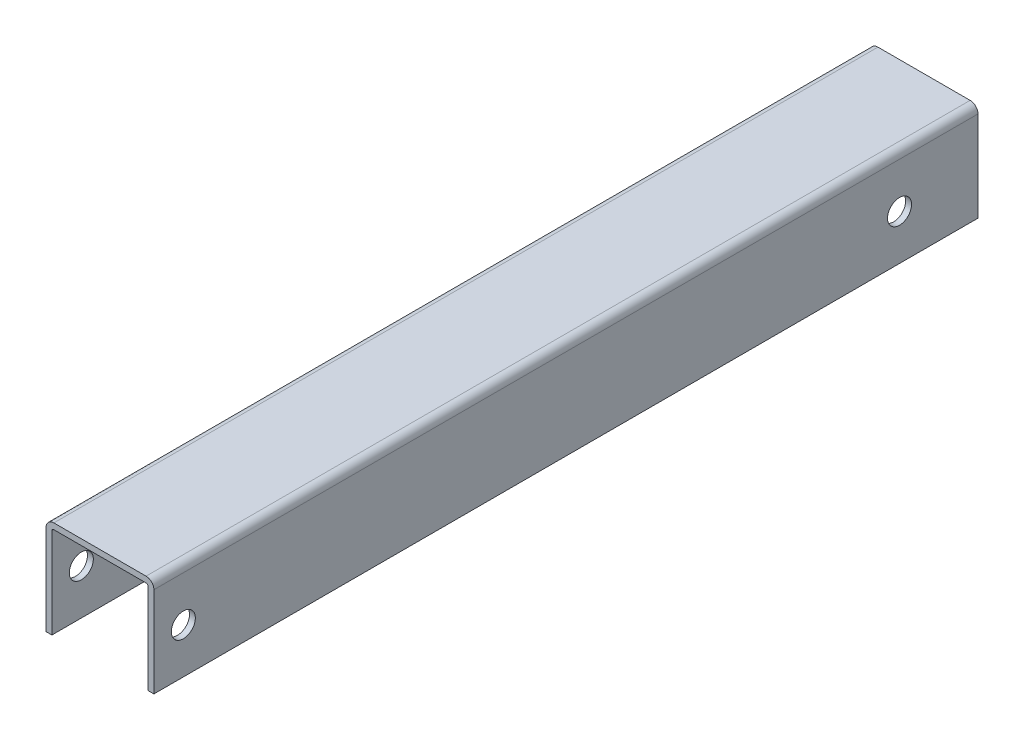
ISO-10303-21;
HEADER;
FILE_DESCRIPTION(('STEP AP214'),'2;1');
FILE_NAME('part.step','',(''),(''),'','','');
FILE_SCHEMA(('AUTOMOTIVE_DESIGN { 1 0 10303 214 1 1 1 1 }'));
ENDSEC;
DATA;
#1=APPLICATION_CONTEXT('core data for automotive mechanical design processes');
#2=APPLICATION_PROTOCOL_DEFINITION('international standard','automotive_design',2000,#1);
#3=PRODUCT_CONTEXT('',#1,'mechanical');
#4=PRODUCT('Part','Part','',(#3));
#5=PRODUCT_RELATED_PRODUCT_CATEGORY('part','',(#4));
#6=PRODUCT_DEFINITION_FORMATION('','',#4);
#7=PRODUCT_DEFINITION_CONTEXT('part definition',#1,'design');
#8=PRODUCT_DEFINITION('design','',#6,#7);
#9=PRODUCT_DEFINITION_SHAPE('','',#8);
#10=(LENGTH_UNIT() NAMED_UNIT(*) SI_UNIT(.MILLI.,.METRE.));
#11=(NAMED_UNIT(*) PLANE_ANGLE_UNIT() SI_UNIT($,.RADIAN.));
#12=(NAMED_UNIT(*) SI_UNIT($,.STERADIAN.) SOLID_ANGLE_UNIT());
#13=UNCERTAINTY_MEASURE_WITH_UNIT(LENGTH_MEASURE(1.E-05),#10,'distance_accuracy_value','');
#14=(GEOMETRIC_REPRESENTATION_CONTEXT(3) GLOBAL_UNCERTAINTY_ASSIGNED_CONTEXT((#13)) GLOBAL_UNIT_ASSIGNED_CONTEXT((#10,
#11,#12)) REPRESENTATION_CONTEXT('',''));
#15=CARTESIAN_POINT('',(0.,0.,0.));
#16=DIRECTION('',(0.,0.,1.));
#17=DIRECTION('',(1.,0.,0.));
#18=AXIS2_PLACEMENT_3D('',#15,#16,#17);
#19=CARTESIAN_POINT('',(26.5568874902646,18.8736489166543,420.));
#20=DIRECTION('',(1.,0.,0.));
#21=DIRECTION('',(0.,1.,0.));
#22=AXIS2_PLACEMENT_3D('',#19,#20,#21);
#23=PLANE('',#22);
#24=CARTESIAN_POINT('',(26.5568874902646,-4.12635108334575,405.));
#25=DIRECTION('',(1.,0.,0.));
#26=DIRECTION('',(0.,1.,0.));
#27=AXIS2_PLACEMENT_3D('',#24,#25,#26);
#28=CIRCLE('',#27,6.12499999999999);
#29=CARTESIAN_POINT('',(26.5568874902646,1.99864891665424,405.));
#30=VERTEX_POINT('',#29);
#31=EDGE_CURVE('E250',#30,#30,#28,.T.);
#32=ORIENTED_EDGE('',*,*,#31,.T.);
#33=EDGE_LOOP('',(#32));
#34=FACE_BOUND('',#33,.T.);
#35=CARTESIAN_POINT('',(26.5568874902646,-4.12635108334575,40.));
#36=DIRECTION('',(1.,0.,0.));
#37=DIRECTION('',(0.,1.,0.));
#38=AXIS2_PLACEMENT_3D('',#35,#36,#37);
#39=CIRCLE('',#38,6.12499999999999);
#40=CARTESIAN_POINT('',(26.5568874902646,1.99864891665424,40.));
#41=VERTEX_POINT('',#40);
#42=EDGE_CURVE('E171',#41,#41,#39,.T.);
#43=ORIENTED_EDGE('',*,*,#42,.T.);
#44=EDGE_LOOP('',(#43));
#45=FACE_BOUND('',#44,.T.);
#46=DIRECTION('',(0.,-1.,0.));
#47=VECTOR('',#46,1.);
#48=CARTESIAN_POINT('',(26.5568874902646,18.8736489166543,0.));
#49=LINE('',#48,#47);
#50=CARTESIAN_POINT('',(26.5568874902646,18.8736489166543,0.));
#51=VERTEX_POINT('',#50);
#52=CARTESIAN_POINT('',(26.5568874902646,-27.1263510833457,0.));
#53=VERTEX_POINT('',#52);
#54=EDGE_CURVE('E166',#51,#53,#49,.T.);
#55=ORIENTED_EDGE('',*,*,#54,.T.);
#56=DIRECTION('',(0.,0.,-1.));
#57=VECTOR('',#56,1.);
#58=CARTESIAN_POINT('',(26.5568874902646,-27.1263510833457,420.));
#59=LINE('',#58,#57);
#60=CARTESIAN_POINT('',(26.5568874902646,-27.1263510833457,420.));
#61=VERTEX_POINT('',#60);
#62=EDGE_CURVE('E11',#61,#53,#59,.T.);
#63=ORIENTED_EDGE('',*,*,#62,.F.);
#64=DIRECTION('',(0.,-1.,0.));
#65=VECTOR('',#64,1.);
#66=CARTESIAN_POINT('',(26.5568874902646,18.8736489166543,420.));
#67=LINE('',#66,#65);
#68=CARTESIAN_POINT('',(26.5568874902646,18.8736489166543,420.));
#69=VERTEX_POINT('',#68);
#70=EDGE_CURVE('E110',#69,#61,#67,.T.);
#71=ORIENTED_EDGE('',*,*,#70,.F.);
#72=DIRECTION('',(0.,0.,-1.));
#73=VECTOR('',#72,1.);
#74=CARTESIAN_POINT('',(26.5568874902646,18.8736489166543,420.));
#75=LINE('',#74,#73);
#76=EDGE_CURVE('E162',#69,#51,#75,.T.);
#77=ORIENTED_EDGE('',*,*,#76,.T.);
#78=EDGE_LOOP('',(#55,#63,#71,#77));
#79=FACE_BOUND('',#78,.T.);
#80=ADVANCED_FACE('F39',(#34,#45,#79),#23,.F.);
#81=CARTESIAN_POINT('',(29.5568874902646,-27.1263510833457,420.));
#82=DIRECTION('',(0.,-1.,0.));
#83=DIRECTION('',(1.,0.,0.));
#84=AXIS2_PLACEMENT_3D('',#81,#82,#83);
#85=PLANE('',#84);
#86=DIRECTION('',(-1.,0.,0.));
#87=VECTOR('',#86,1.);
#88=CARTESIAN_POINT('',(29.5568874902646,-27.1263510833457,0.));
#89=LINE('',#88,#87);
#90=CARTESIAN_POINT('',(29.5568874902646,-27.1263510833457,0.));
#91=VERTEX_POINT('',#90);
#92=EDGE_CURVE('E170',#91,#53,#89,.T.);
#93=ORIENTED_EDGE('',*,*,#92,.F.);
#94=DIRECTION('',(0.,0.,-1.));
#95=VECTOR('',#94,1.);
#96=CARTESIAN_POINT('',(29.5568874902646,-27.1263510833457,420.));
#97=LINE('',#96,#95);
#98=CARTESIAN_POINT('',(29.5568874902646,-27.1263510833457,420.));
#99=VERTEX_POINT('',#98);
#100=EDGE_CURVE('E49',#99,#91,#97,.T.);
#101=ORIENTED_EDGE('',*,*,#100,.F.);
#102=DIRECTION('',(-1.,0.,0.));
#103=VECTOR('',#102,1.);
#104=CARTESIAN_POINT('',(29.5568874902646,-27.1263510833457,420.));
#105=LINE('',#104,#103);
#106=EDGE_CURVE('E256',#99,#61,#105,.T.);
#107=ORIENTED_EDGE('',*,*,#106,.T.);
#108=ORIENTED_EDGE('',*,*,#62,.T.);
#109=EDGE_LOOP('',(#93,#101,#107,#108));
#110=FACE_BOUND('',#109,.T.);
#111=ADVANCED_FACE('F311',(#110),#85,.T.);
#112=CARTESIAN_POINT('',(29.5568874902646,18.8736489166543,420.));
#113=DIRECTION('',(1.,0.,0.));
#114=DIRECTION('',(0.,1.,0.));
#115=AXIS2_PLACEMENT_3D('',#112,#113,#114);
#116=PLANE('',#115);
#117=CARTESIAN_POINT('',(29.5568874902646,-4.12635108334575,405.));
#118=DIRECTION('',(-1.,0.,0.));
#119=DIRECTION('',(0.,0.,1.));
#120=AXIS2_PLACEMENT_3D('',#117,#118,#119);
#121=CIRCLE('',#120,6.12499999999999);
#122=CARTESIAN_POINT('',(29.5568874902646,-4.12635108334575,411.125));
#123=VERTEX_POINT('',#122);
#124=EDGE_CURVE('E354',#123,#123,#121,.T.);
#125=ORIENTED_EDGE('',*,*,#124,.T.);
#126=EDGE_LOOP('',(#125));
#127=FACE_BOUND('',#126,.T.);
#128=CARTESIAN_POINT('',(29.5568874902646,-4.12635108334575,40.));
#129=DIRECTION('',(-1.,0.,0.));
#130=DIRECTION('',(0.,0.,1.));
#131=AXIS2_PLACEMENT_3D('',#128,#129,#130);
#132=CIRCLE('',#131,6.12499999999999);
#133=CARTESIAN_POINT('',(29.5568874902646,-4.12635108334575,46.125));
#134=VERTEX_POINT('',#133);
#135=EDGE_CURVE('E236',#134,#134,#132,.T.);
#136=ORIENTED_EDGE('',*,*,#135,.T.);
#137=EDGE_LOOP('',(#136));
#138=FACE_BOUND('',#137,.T.);
#139=DIRECTION('',(0.,-1.,0.));
#140=VECTOR('',#139,1.);
#141=CARTESIAN_POINT('',(29.5568874902646,18.8736489166543,0.));
#142=LINE('',#141,#140);
#143=CARTESIAN_POINT('',(29.5568874902646,18.8736489166543,0.));
#144=VERTEX_POINT('',#143);
#145=EDGE_CURVE('E175',#144,#91,#142,.T.);
#146=ORIENTED_EDGE('',*,*,#145,.F.);
#147=DIRECTION('',(0.,0.,-1.));
#148=VECTOR('',#147,1.);
#149=CARTESIAN_POINT('',(29.5568874902646,18.8736489166543,420.));
#150=LINE('',#149,#148);
#151=CARTESIAN_POINT('',(29.5568874902646,18.8736489166543,420.));
#152=VERTEX_POINT('',#151);
#153=EDGE_CURVE('E229',#152,#144,#150,.T.);
#154=ORIENTED_EDGE('',*,*,#153,.F.);
#155=DIRECTION('',(0.,-1.,0.));
#156=VECTOR('',#155,1.);
#157=CARTESIAN_POINT('',(29.5568874902646,18.8736489166543,420.));
#158=LINE('',#157,#156);
#159=EDGE_CURVE('E260',#152,#99,#158,.T.);
#160=ORIENTED_EDGE('',*,*,#159,.T.);
#161=ORIENTED_EDGE('',*,*,#100,.T.);
#162=EDGE_LOOP('',(#146,#154,#160,#161));
#163=FACE_BOUND('',#162,.T.);
#164=ADVANCED_FACE('F316',(#127,#138,#163),#116,.T.);
#165=CARTESIAN_POINT('',(25.5568874902646,18.8736489166543,420.));
#166=DIRECTION('',(0.,0.,-1.));
#167=DIRECTION('',(-1.,0.,0.));
#168=AXIS2_PLACEMENT_3D('',#165,#166,#167);
#169=CYLINDRICAL_SURFACE('',#168,4.);
#170=CARTESIAN_POINT('',(25.5568874902646,18.8736489166543,0.));
#171=DIRECTION('',(0.,0.,-1.));
#172=DIRECTION('',(-1.,0.,0.));
#173=AXIS2_PLACEMENT_3D('',#170,#171,#172);
#174=CIRCLE('',#173,4.);
#175=CARTESIAN_POINT('',(25.5568874902646,22.8736489166543,0.));
#176=VERTEX_POINT('',#175);
#177=EDGE_CURVE('E179',#176,#144,#174,.T.);
#178=ORIENTED_EDGE('',*,*,#177,.F.);
#179=DIRECTION('',(0.,0.,-1.));
#180=VECTOR('',#179,1.);
#181=CARTESIAN_POINT('',(25.5568874902646,22.8736489166543,420.));
#182=LINE('',#181,#180);
#183=CARTESIAN_POINT('',(25.5568874902646,22.8736489166543,420.));
#184=VERTEX_POINT('',#183);
#185=EDGE_CURVE('E226',#184,#176,#182,.T.);
#186=ORIENTED_EDGE('',*,*,#185,.F.);
#187=CARTESIAN_POINT('',(25.5568874902646,18.8736489166543,420.));
#188=DIRECTION('',(0.,0.,-1.));
#189=DIRECTION('',(-1.,0.,0.));
#190=AXIS2_PLACEMENT_3D('',#187,#188,#189);
#191=CIRCLE('',#190,4.);
#192=EDGE_CURVE('E264',#184,#152,#191,.T.);
#193=ORIENTED_EDGE('',*,*,#192,.T.);
#194=ORIENTED_EDGE('',*,*,#153,.T.);
#195=EDGE_LOOP('',(#178,#186,#193,#194));
#196=FACE_BOUND('',#195,.T.);
#197=ADVANCED_FACE('F330',(#196),#169,.T.);
#198=CARTESIAN_POINT('',(-21.4431125097354,22.8736489166543,420.));
#199=DIRECTION('',(0.,1.,0.));
#200=DIRECTION('',(0.,0.,1.));
#201=AXIS2_PLACEMENT_3D('',#198,#199,#200);
#202=PLANE('',#201);
#203=DIRECTION('',(1.,0.,0.));
#204=VECTOR('',#203,1.);
#205=CARTESIAN_POINT('',(-21.4431125097354,22.8736489166543,0.));
#206=LINE('',#205,#204);
#207=CARTESIAN_POINT('',(-21.4431125097354,22.8736489166543,0.));
#208=VERTEX_POINT('',#207);
#209=EDGE_CURVE('E183',#208,#176,#206,.T.);
#210=ORIENTED_EDGE('',*,*,#209,.F.);
#211=DIRECTION('',(0.,0.,-1.));
#212=VECTOR('',#211,1.);
#213=CARTESIAN_POINT('',(-21.4431125097354,22.8736489166543,420.));
#214=LINE('',#213,#212);
#215=CARTESIAN_POINT('',(-21.4431125097354,22.8736489166543,420.));
#216=VERTEX_POINT('',#215);
#217=EDGE_CURVE('E223',#216,#208,#214,.T.);
#218=ORIENTED_EDGE('',*,*,#217,.F.);
#219=DIRECTION('',(1.,0.,0.));
#220=VECTOR('',#219,1.);
#221=CARTESIAN_POINT('',(-21.4431125097354,22.8736489166543,420.));
#222=LINE('',#221,#220);
#223=EDGE_CURVE('E268',#216,#184,#222,.T.);
#224=ORIENTED_EDGE('',*,*,#223,.T.);
#225=ORIENTED_EDGE('',*,*,#185,.T.);
#226=EDGE_LOOP('',(#210,#218,#224,#225));
#227=FACE_BOUND('',#226,.T.);
#228=ADVANCED_FACE('F333',(#227),#202,.T.);
#229=CARTESIAN_POINT('',(-21.4431125097354,18.8736489166543,420.));
#230=DIRECTION('',(0.,0.,-1.));
#231=DIRECTION('',(-1.,0.,0.));
#232=AXIS2_PLACEMENT_3D('',#229,#230,#231);
#233=CYLINDRICAL_SURFACE('',#232,4.);
#234=CARTESIAN_POINT('',(-21.4431125097354,18.8736489166543,0.));
#235=DIRECTION('',(0.,0.,-1.));
#236=DIRECTION('',(1.,0.,0.));
#237=AXIS2_PLACEMENT_3D('',#234,#235,#236);
#238=CIRCLE('',#237,4.);
#239=CARTESIAN_POINT('',(-25.4431125097354,18.8736489166543,0.));
#240=VERTEX_POINT('',#239);
#241=EDGE_CURVE('E187',#240,#208,#238,.T.);
#242=ORIENTED_EDGE('',*,*,#241,.F.);
#243=DIRECTION('',(0.,0.,-1.));
#244=VECTOR('',#243,1.);
#245=CARTESIAN_POINT('',(-25.4431125097354,18.8736489166543,420.));
#246=LINE('',#245,#244);
#247=CARTESIAN_POINT('',(-25.4431125097354,18.8736489166543,420.));
#248=VERTEX_POINT('',#247);
#249=EDGE_CURVE('E220',#248,#240,#246,.T.);
#250=ORIENTED_EDGE('',*,*,#249,.F.);
#251=CARTESIAN_POINT('',(-21.4431125097354,18.8736489166543,420.));
#252=DIRECTION('',(0.,0.,-1.));
#253=DIRECTION('',(1.,0.,0.));
#254=AXIS2_PLACEMENT_3D('',#251,#252,#253);
#255=CIRCLE('',#254,4.);
#256=EDGE_CURVE('E272',#248,#216,#255,.T.);
#257=ORIENTED_EDGE('',*,*,#256,.T.);
#258=ORIENTED_EDGE('',*,*,#217,.T.);
#259=EDGE_LOOP('',(#242,#250,#257,#258));
#260=FACE_BOUND('',#259,.T.);
#261=ADVANCED_FACE('F335',(#260),#233,.T.);
#262=CARTESIAN_POINT('',(-25.4431125097354,18.8736489166543,420.));
#263=DIRECTION('',(-1.,0.,0.));
#264=DIRECTION('',(0.,-1.,0.));
#265=AXIS2_PLACEMENT_3D('',#262,#263,#264);
#266=PLANE('',#265);
#267=CARTESIAN_POINT('',(-25.4431125097354,-4.12635108334575,405.));
#268=DIRECTION('',(-1.,0.,0.));
#269=DIRECTION('',(0.,0.,1.));
#270=AXIS2_PLACEMENT_3D('',#267,#268,#269);
#271=CIRCLE('',#270,6.12499999999999);
#272=CARTESIAN_POINT('',(-25.4431125097354,-4.12635108334575,411.125));
#273=VERTEX_POINT('',#272);
#274=EDGE_CURVE('E357',#273,#273,#271,.T.);
#275=ORIENTED_EDGE('',*,*,#274,.F.);
#276=EDGE_LOOP('',(#275));
#277=FACE_BOUND('',#276,.T.);
#278=CARTESIAN_POINT('',(-25.4431125097354,-4.12635108334575,40.));
#279=DIRECTION('',(-1.,0.,0.));
#280=DIRECTION('',(0.,0.,1.));
#281=AXIS2_PLACEMENT_3D('',#278,#279,#280);
#282=CIRCLE('',#281,6.12499999999999);
#283=CARTESIAN_POINT('',(-25.4431125097354,-4.12635108334575,46.125));
#284=VERTEX_POINT('',#283);
#285=EDGE_CURVE('E244',#284,#284,#282,.T.);
#286=ORIENTED_EDGE('',*,*,#285,.F.);
#287=EDGE_LOOP('',(#286));
#288=FACE_BOUND('',#287,.T.);
#289=DIRECTION('',(0.,1.,0.));
#290=VECTOR('',#289,1.);
#291=CARTESIAN_POINT('',(-25.4431125097354,18.8736489166543,0.));
#292=LINE('',#291,#290);
#293=CARTESIAN_POINT('',(-25.4431125097354,-27.1263510833457,0.));
#294=VERTEX_POINT('',#293);
#295=EDGE_CURVE('E191',#294,#240,#292,.T.);
#296=ORIENTED_EDGE('',*,*,#295,.F.);
#297=DIRECTION('',(0.,0.,-1.));
#298=VECTOR('',#297,1.);
#299=CARTESIAN_POINT('',(-25.4431125097354,-27.1263510833457,420.));
#300=LINE('',#299,#298);
#301=CARTESIAN_POINT('',(-25.4431125097354,-27.1263510833457,420.));
#302=VERTEX_POINT('',#301);
#303=EDGE_CURVE('E217',#302,#294,#300,.T.);
#304=ORIENTED_EDGE('',*,*,#303,.F.);
#305=DIRECTION('',(0.,1.,0.));
#306=VECTOR('',#305,1.);
#307=CARTESIAN_POINT('',(-25.4431125097354,18.8736489166543,420.));
#308=LINE('',#307,#306);
#309=EDGE_CURVE('E276',#302,#248,#308,.T.);
#310=ORIENTED_EDGE('',*,*,#309,.T.);
#311=ORIENTED_EDGE('',*,*,#249,.T.);
#312=EDGE_LOOP('',(#296,#304,#310,#311));
#313=FACE_BOUND('',#312,.T.);
#314=ADVANCED_FACE('F292',(#277,#288,#313),#266,.T.);
#315=CARTESIAN_POINT('',(-22.4431125097354,-27.1263510833457,420.));
#316=DIRECTION('',(0.,-1.,0.));
#317=DIRECTION('',(1.,0.,0.));
#318=AXIS2_PLACEMENT_3D('',#315,#316,#317);
#319=PLANE('',#318);
#320=DIRECTION('',(-1.,0.,0.));
#321=VECTOR('',#320,1.);
#322=CARTESIAN_POINT('',(-22.4431125097354,-27.1263510833457,0.));
#323=LINE('',#322,#321);
#324=CARTESIAN_POINT('',(-22.4431125097354,-27.1263510833457,0.));
#325=VERTEX_POINT('',#324);
#326=EDGE_CURVE('E195',#325,#294,#323,.T.);
#327=ORIENTED_EDGE('',*,*,#326,.F.);
#328=DIRECTION('',(0.,0.,-1.));
#329=VECTOR('',#328,1.);
#330=CARTESIAN_POINT('',(-22.4431125097354,-27.1263510833457,420.));
#331=LINE('',#330,#329);
#332=CARTESIAN_POINT('',(-22.4431125097354,-27.1263510833457,420.));
#333=VERTEX_POINT('',#332);
#334=EDGE_CURVE('E214',#333,#325,#331,.T.);
#335=ORIENTED_EDGE('',*,*,#334,.F.);
#336=DIRECTION('',(-1.,0.,0.));
#337=VECTOR('',#336,1.);
#338=CARTESIAN_POINT('',(-22.4431125097354,-27.1263510833457,420.));
#339=LINE('',#338,#337);
#340=EDGE_CURVE('E280',#333,#302,#339,.T.);
#341=ORIENTED_EDGE('',*,*,#340,.T.);
#342=ORIENTED_EDGE('',*,*,#303,.T.);
#343=EDGE_LOOP('',(#327,#335,#341,#342));
#344=FACE_BOUND('',#343,.T.);
#345=ADVANCED_FACE('F286',(#344),#319,.T.);
#346=CARTESIAN_POINT('',(-22.4431125097354,18.8736489166543,420.));
#347=DIRECTION('',(-1.,0.,0.));
#348=DIRECTION('',(0.,-1.,0.));
#349=AXIS2_PLACEMENT_3D('',#346,#347,#348);
#350=PLANE('',#349);
#351=CARTESIAN_POINT('',(-22.4431125097354,-4.12635108334575,405.));
#352=DIRECTION('',(-1.,0.,0.));
#353=DIRECTION('',(0.,-1.,0.));
#354=AXIS2_PLACEMENT_3D('',#351,#352,#353);
#355=CIRCLE('',#354,6.12499999999999);
#356=CARTESIAN_POINT('',(-22.4431125097354,-10.2513510833457,405.));
#357=VERTEX_POINT('',#356);
#358=EDGE_CURVE('E42',#357,#357,#355,.T.);
#359=ORIENTED_EDGE('',*,*,#358,.T.);
#360=EDGE_LOOP('',(#359));
#361=FACE_BOUND('',#360,.T.);
#362=CARTESIAN_POINT('',(-22.4431125097354,-4.12635108334575,40.));
#363=DIRECTION('',(-1.,0.,0.));
#364=DIRECTION('',(0.,-1.,0.));
#365=AXIS2_PLACEMENT_3D('',#362,#363,#364);
#366=CIRCLE('',#365,6.12499999999999);
#367=CARTESIAN_POINT('',(-22.4431125097354,-10.2513510833457,40.));
#368=VERTEX_POINT('',#367);
#369=EDGE_CURVE('E233',#368,#368,#366,.T.);
#370=ORIENTED_EDGE('',*,*,#369,.T.);
#371=EDGE_LOOP('',(#370));
#372=FACE_BOUND('',#371,.T.);
#373=DIRECTION('',(0.,1.,0.));
#374=VECTOR('',#373,1.);
#375=CARTESIAN_POINT('',(-22.4431125097354,18.8736489166543,0.));
#376=LINE('',#375,#374);
#377=CARTESIAN_POINT('',(-22.4431125097354,18.8736489166543,0.));
#378=VERTEX_POINT('',#377);
#379=EDGE_CURVE('E199',#325,#378,#376,.T.);
#380=ORIENTED_EDGE('',*,*,#379,.T.);
#381=DIRECTION('',(0.,0.,-1.));
#382=VECTOR('',#381,1.);
#383=CARTESIAN_POINT('',(-22.4431125097354,18.8736489166543,420.));
#384=LINE('',#383,#382);
#385=CARTESIAN_POINT('',(-22.4431125097354,18.8736489166543,420.));
#386=VERTEX_POINT('',#385);
#387=EDGE_CURVE('E155',#386,#378,#384,.T.);
#388=ORIENTED_EDGE('',*,*,#387,.F.);
#389=DIRECTION('',(0.,1.,0.));
#390=VECTOR('',#389,1.);
#391=CARTESIAN_POINT('',(-22.4431125097354,18.8736489166543,420.));
#392=LINE('',#391,#390);
#393=EDGE_CURVE('E144',#333,#386,#392,.T.);
#394=ORIENTED_EDGE('',*,*,#393,.F.);
#395=ORIENTED_EDGE('',*,*,#334,.T.);
#396=EDGE_LOOP('',(#380,#388,#394,#395));
#397=FACE_BOUND('',#396,.T.);
#398=ADVANCED_FACE('F299',(#361,#372,#397),#350,.F.);
#399=CARTESIAN_POINT('',(-21.4431125097354,18.8736489166543,420.));
#400=DIRECTION('',(0.,0.,-1.));
#401=DIRECTION('',(-1.,0.,0.));
#402=AXIS2_PLACEMENT_3D('',#399,#400,#401);
#403=CYLINDRICAL_SURFACE('',#402,1.);
#404=CARTESIAN_POINT('',(-21.4431125097354,18.8736489166543,0.));
#405=DIRECTION('',(0.,0.,1.));
#406=DIRECTION('',(1.,0.,0.));
#407=AXIS2_PLACEMENT_3D('',#404,#405,#406);
#408=CIRCLE('',#407,1.);
#409=CARTESIAN_POINT('',(-21.4431125097354,19.8736489166543,0.));
#410=VERTEX_POINT('',#409);
#411=EDGE_CURVE('E153',#378,#410,#408,.F.);
#412=ORIENTED_EDGE('',*,*,#411,.T.);
#413=DIRECTION('',(0.,0.,-1.));
#414=VECTOR('',#413,1.);
#415=CARTESIAN_POINT('',(-21.4431125097354,19.8736489166543,420.));
#416=LINE('',#415,#414);
#417=CARTESIAN_POINT('',(-21.4431125097354,19.8736489166543,420.));
#418=VERTEX_POINT('',#417);
#419=EDGE_CURVE('E150',#418,#410,#416,.T.);
#420=ORIENTED_EDGE('',*,*,#419,.F.);
#421=CARTESIAN_POINT('',(-21.4431125097354,18.8736489166543,420.));
#422=DIRECTION('',(0.,0.,1.));
#423=DIRECTION('',(1.,0.,0.));
#424=AXIS2_PLACEMENT_3D('',#421,#422,#423);
#425=CIRCLE('',#424,1.);
#426=EDGE_CURVE('E137',#386,#418,#425,.F.);
#427=ORIENTED_EDGE('',*,*,#426,.F.);
#428=ORIENTED_EDGE('',*,*,#387,.T.);
#429=EDGE_LOOP('',(#412,#420,#427,#428));
#430=FACE_BOUND('',#429,.T.);
#431=ADVANCED_FACE('F151',(#430),#403,.F.);
#432=CARTESIAN_POINT('',(-21.4431125097354,19.8736489166543,420.));
#433=DIRECTION('',(0.,1.,0.));
#434=DIRECTION('',(0.,0.,1.));
#435=AXIS2_PLACEMENT_3D('',#432,#433,#434);
#436=PLANE('',#435);
#437=DIRECTION('',(1.,0.,0.));
#438=VECTOR('',#437,1.);
#439=CARTESIAN_POINT('',(-21.4431125097354,19.8736489166543,0.));
#440=LINE('',#439,#438);
#441=CARTESIAN_POINT('',(25.5568874902646,19.8736489166543,0.));
#442=VERTEX_POINT('',#441);
#443=EDGE_CURVE('E98',#410,#442,#440,.T.);
#444=ORIENTED_EDGE('',*,*,#443,.T.);
#445=DIRECTION('',(0.,0.,-1.));
#446=VECTOR('',#445,1.);
#447=CARTESIAN_POINT('',(25.5568874902646,19.8736489166543,420.));
#448=LINE('',#447,#446);
#449=CARTESIAN_POINT('',(25.5568874902646,19.8736489166543,420.));
#450=VERTEX_POINT('',#449);
#451=EDGE_CURVE('E156',#450,#442,#448,.T.);
#452=ORIENTED_EDGE('',*,*,#451,.F.);
#453=DIRECTION('',(1.,0.,0.));
#454=VECTOR('',#453,1.);
#455=CARTESIAN_POINT('',(-21.4431125097354,19.8736489166543,420.));
#456=LINE('',#455,#454);
#457=EDGE_CURVE('E141',#418,#450,#456,.T.);
#458=ORIENTED_EDGE('',*,*,#457,.F.);
#459=ORIENTED_EDGE('',*,*,#419,.T.);
#460=EDGE_LOOP('',(#444,#452,#458,#459));
#461=FACE_BOUND('',#460,.T.);
#462=ADVANCED_FACE('F158',(#461),#436,.F.);
#463=CARTESIAN_POINT('',(25.5568874902646,18.8736489166543,420.));
#464=DIRECTION('',(0.,0.,-1.));
#465=DIRECTION('',(-1.,0.,0.));
#466=AXIS2_PLACEMENT_3D('',#463,#464,#465);
#467=CYLINDRICAL_SURFACE('',#466,1.);
#468=CARTESIAN_POINT('',(25.5568874902646,18.8736489166543,0.));
#469=DIRECTION('',(0.,0.,1.));
#470=DIRECTION('',(1.,0.,0.));
#471=AXIS2_PLACEMENT_3D('',#468,#469,#470);
#472=CIRCLE('',#471,1.);
#473=EDGE_CURVE('E104',#442,#51,#472,.F.);
#474=ORIENTED_EDGE('',*,*,#473,.T.);
#475=ORIENTED_EDGE('',*,*,#76,.F.);
#476=CARTESIAN_POINT('',(25.5568874902646,18.8736489166543,420.));
#477=DIRECTION('',(0.,0.,1.));
#478=DIRECTION('',(1.,0.,0.));
#479=AXIS2_PLACEMENT_3D('',#476,#477,#478);
#480=CIRCLE('',#479,1.);
#481=EDGE_CURVE('E58',#450,#69,#480,.F.);
#482=ORIENTED_EDGE('',*,*,#481,.F.);
#483=ORIENTED_EDGE('',*,*,#451,.T.);
#484=EDGE_LOOP('',(#474,#475,#482,#483));
#485=FACE_BOUND('',#484,.T.);
#486=ADVANCED_FACE('F386',(#485),#467,.F.);
#487=CARTESIAN_POINT('',(25.5568874902646,18.8736489166543,420.));
#488=DIRECTION('',(0.,0.,-1.));
#489=DIRECTION('',(-1.,0.,0.));
#490=AXIS2_PLACEMENT_3D('',#487,#488,#489);
#491=PLANE('',#490);
#492=ORIENTED_EDGE('',*,*,#70,.T.);
#493=ORIENTED_EDGE('',*,*,#106,.F.);
#494=ORIENTED_EDGE('',*,*,#159,.F.);
#495=ORIENTED_EDGE('',*,*,#192,.F.);
#496=ORIENTED_EDGE('',*,*,#223,.F.);
#497=ORIENTED_EDGE('',*,*,#256,.F.);
#498=ORIENTED_EDGE('',*,*,#309,.F.);
#499=ORIENTED_EDGE('',*,*,#340,.F.);
#500=ORIENTED_EDGE('',*,*,#393,.T.);
#501=ORIENTED_EDGE('',*,*,#426,.T.);
#502=ORIENTED_EDGE('',*,*,#457,.T.);
#503=ORIENTED_EDGE('',*,*,#481,.T.);
#504=EDGE_LOOP('',(#492,#493,#494,#495,#496,#497,#498,#499,#500,#501,#502,#503));
#505=FACE_BOUND('',#504,.T.);
#506=ADVANCED_FACE('F139',(#505),#491,.F.);
#507=CARTESIAN_POINT('',(25.5568874902646,18.8736489166543,0.));
#508=DIRECTION('',(0.,0.,-1.));
#509=DIRECTION('',(-1.,0.,0.));
#510=AXIS2_PLACEMENT_3D('',#507,#508,#509);
#511=PLANE('',#510);
#512=ORIENTED_EDGE('',*,*,#54,.F.);
#513=ORIENTED_EDGE('',*,*,#473,.F.);
#514=ORIENTED_EDGE('',*,*,#443,.F.);
#515=ORIENTED_EDGE('',*,*,#411,.F.);
#516=ORIENTED_EDGE('',*,*,#379,.F.);
#517=ORIENTED_EDGE('',*,*,#326,.T.);
#518=ORIENTED_EDGE('',*,*,#295,.T.);
#519=ORIENTED_EDGE('',*,*,#241,.T.);
#520=ORIENTED_EDGE('',*,*,#209,.T.);
#521=ORIENTED_EDGE('',*,*,#177,.T.);
#522=ORIENTED_EDGE('',*,*,#145,.T.);
#523=ORIENTED_EDGE('',*,*,#92,.T.);
#524=EDGE_LOOP('',(#512,#513,#514,#515,#516,#517,#518,#519,#520,#521,#522,#523));
#525=FACE_BOUND('',#524,.T.);
#526=ADVANCED_FACE('F297',(#525),#511,.T.);
#527=CARTESIAN_POINT('',(-25.4431125097354,-4.12635108334575,40.));
#528=DIRECTION('',(-1.,0.,0.));
#529=DIRECTION('',(0.,0.,1.));
#530=AXIS2_PLACEMENT_3D('',#527,#528,#529);
#531=CYLINDRICAL_SURFACE('',#530,6.12499999999999);
#532=ORIENTED_EDGE('',*,*,#285,.T.);
#533=EDGE_LOOP('',(#532));
#534=FACE_BOUND('',#533,.T.);
#535=ORIENTED_EDGE('',*,*,#369,.F.);
#536=EDGE_LOOP('',(#535));
#537=FACE_BOUND('',#536,.T.);
#538=ADVANCED_FACE('F371',(#534,#537),#531,.F.);
#539=ORIENTED_EDGE('',*,*,#135,.F.);
#540=EDGE_LOOP('',(#539));
#541=FACE_BOUND('',#540,.T.);
#542=ORIENTED_EDGE('',*,*,#42,.F.);
#543=EDGE_LOOP('',(#542));
#544=FACE_BOUND('',#543,.T.);
#545=ADVANCED_FACE('F374',(#541,#544),#531,.F.);
#546=CARTESIAN_POINT('',(-25.4431125097354,-4.12635108334575,405.));
#547=DIRECTION('',(-1.,0.,0.));
#548=DIRECTION('',(0.,0.,1.));
#549=AXIS2_PLACEMENT_3D('',#546,#547,#548);
#550=CYLINDRICAL_SURFACE('',#549,6.12499999999999);
#551=ORIENTED_EDGE('',*,*,#274,.T.);
#552=EDGE_LOOP('',(#551));
#553=FACE_BOUND('',#552,.T.);
#554=ORIENTED_EDGE('',*,*,#358,.F.);
#555=EDGE_LOOP('',(#554));
#556=FACE_BOUND('',#555,.T.);
#557=ADVANCED_FACE('F366',(#553,#556),#550,.F.);
#558=ORIENTED_EDGE('',*,*,#124,.F.);
#559=EDGE_LOOP('',(#558));
#560=FACE_BOUND('',#559,.T.);
#561=ORIENTED_EDGE('',*,*,#31,.F.);
#562=EDGE_LOOP('',(#561));
#563=FACE_BOUND('',#562,.T.);
#564=ADVANCED_FACE('F384',(#560,#563),#550,.F.);
#565=CLOSED_SHELL('',(#80,#111,#164,#197,#228,#261,#314,#345,#398,#431,#462,#486,#506,#526,#538,
#545,#557,#564));
#566=MANIFOLD_SOLID_BREP('B2',#565);
#567=ADVANCED_BREP_SHAPE_REPRESENTATION('',(#18,#566),#14);
#568=SHAPE_DEFINITION_REPRESENTATION(#9,#567);
ENDSEC;
END-ISO-10303-21;
